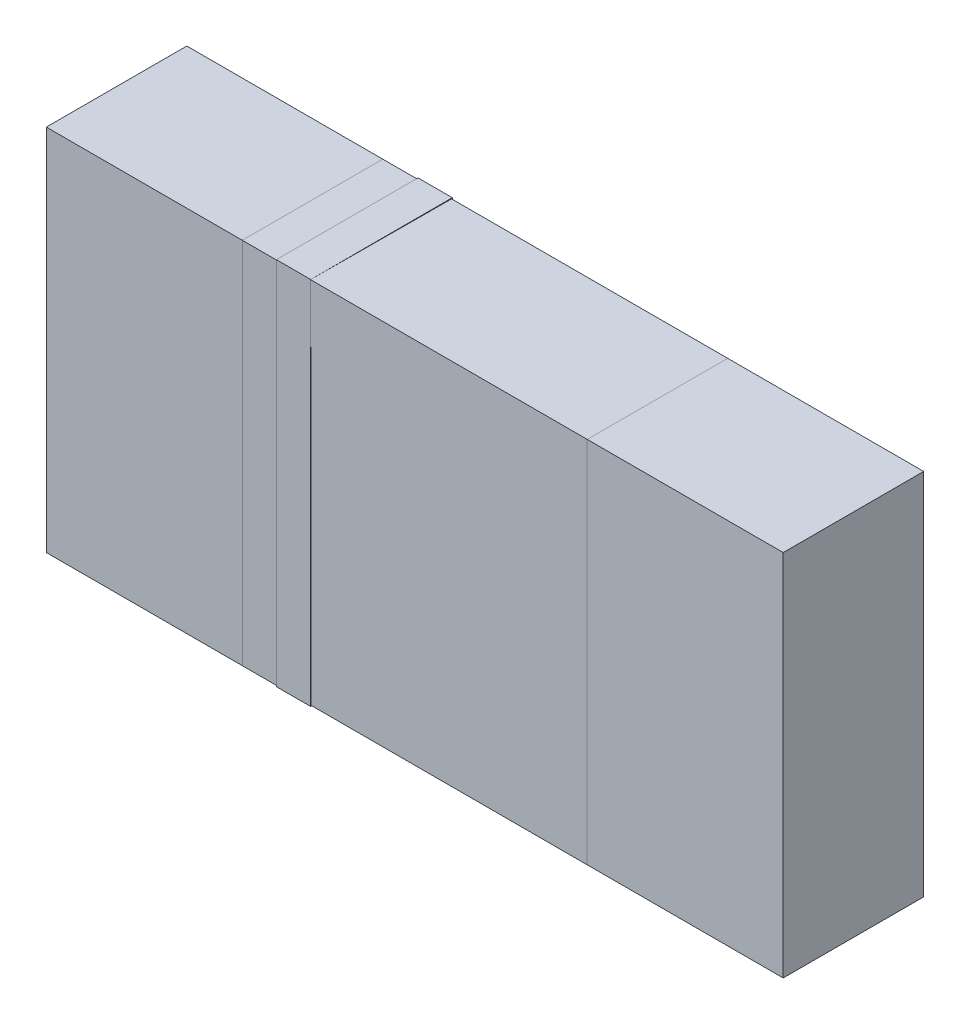
ISO-10303-21;
HEADER;
FILE_DESCRIPTION(('STEP AP214'),'2;1');
FILE_NAME('part.step','',(''),(''),'','','');
FILE_SCHEMA(('AUTOMOTIVE_DESIGN { 1 0 10303 214 1 1 1 1 }'));
ENDSEC;
DATA;
#1=APPLICATION_CONTEXT('core data for automotive mechanical design processes');
#2=APPLICATION_PROTOCOL_DEFINITION('international standard','automotive_design',2000,#1);
#3=PRODUCT_CONTEXT('',#1,'mechanical');
#4=PRODUCT('Part','Part','',(#3));
#5=PRODUCT_RELATED_PRODUCT_CATEGORY('part','',(#4));
#6=PRODUCT_DEFINITION_FORMATION('','',#4);
#7=PRODUCT_DEFINITION_CONTEXT('part definition',#1,'design');
#8=PRODUCT_DEFINITION('design','',#6,#7);
#9=PRODUCT_DEFINITION_SHAPE('','',#8);
#10=(LENGTH_UNIT() NAMED_UNIT(*) SI_UNIT(.MILLI.,.METRE.));
#11=(NAMED_UNIT(*) PLANE_ANGLE_UNIT() SI_UNIT($,.RADIAN.));
#12=(NAMED_UNIT(*) SI_UNIT($,.STERADIAN.) SOLID_ANGLE_UNIT());
#13=UNCERTAINTY_MEASURE_WITH_UNIT(LENGTH_MEASURE(1.E-05),#10,'distance_accuracy_value','');
#14=(GEOMETRIC_REPRESENTATION_CONTEXT(3) GLOBAL_UNCERTAINTY_ASSIGNED_CONTEXT((#13)) GLOBAL_UNIT_ASSIGNED_CONTEXT((#10,
#11,#12)) REPRESENTATION_CONTEXT('',''));
#15=CARTESIAN_POINT('',(0.,0.,0.));
#16=DIRECTION('',(0.,0.,1.));
#17=DIRECTION('',(1.,0.,0.));
#18=AXIS2_PLACEMENT_3D('',#15,#16,#17);
#19=CARTESIAN_POINT('',(0.749,-0.8,0.61));
#20=DIRECTION('',(0.,0.,1.));
#21=DIRECTION('',(1.,0.,0.));
#22=AXIS2_PLACEMENT_3D('',#19,#20,#21);
#23=PLANE('',#22);
#24=DIRECTION('',(1.,0.,0.));
#25=VECTOR('',#24,1.);
#26=CARTESIAN_POINT('',(0.749,-0.8,0.61));
#27=LINE('',#26,#25);
#28=CARTESIAN_POINT('',(0.749,-0.8,0.61));
#29=VERTEX_POINT('',#28);
#30=CARTESIAN_POINT('',(1.6,-0.8,0.61));
#31=VERTEX_POINT('',#30);
#32=EDGE_CURVE('P0_E83',#29,#31,#27,.T.);
#33=ORIENTED_EDGE('',*,*,#32,.T.);
#34=DIRECTION('',(0.,1.,0.));
#35=VECTOR('',#34,1.);
#36=CARTESIAN_POINT('',(1.6,-0.8,0.61));
#37=LINE('',#36,#35);
#38=CARTESIAN_POINT('',(1.6,0.8,0.61));
#39=VERTEX_POINT('',#38);
#40=EDGE_CURVE('P0_E70',#31,#39,#37,.T.);
#41=ORIENTED_EDGE('',*,*,#40,.T.);
#42=DIRECTION('',(-1.,0.,0.));
#43=VECTOR('',#42,1.);
#44=CARTESIAN_POINT('',(1.6,0.8,0.61));
#45=LINE('',#44,#43);
#46=CARTESIAN_POINT('',(0.749,0.8,0.61));
#47=VERTEX_POINT('',#46);
#48=EDGE_CURVE('P0_E98',#39,#47,#45,.T.);
#49=ORIENTED_EDGE('',*,*,#48,.T.);
#50=DIRECTION('',(0.,-1.,0.));
#51=VECTOR('',#50,1.);
#52=CARTESIAN_POINT('',(0.749,0.8,0.61));
#53=LINE('',#52,#51);
#54=EDGE_CURVE('P0_E11',#47,#29,#53,.T.);
#55=ORIENTED_EDGE('',*,*,#54,.T.);
#56=EDGE_LOOP('',(#33,#41,#49,#55));
#57=FACE_BOUND('',#56,.T.);
#58=ADVANCED_FACE('P0_F17',(#57),#23,.T.);
#59=CARTESIAN_POINT('',(0.749,0.8,0.));
#60=DIRECTION('',(0.,0.,-1.));
#61=DIRECTION('',(0.,-1.,0.));
#62=AXIS2_PLACEMENT_3D('',#59,#60,#61);
#63=PLANE('',#62);
#64=DIRECTION('',(1.,0.,0.));
#65=VECTOR('',#64,1.);
#66=CARTESIAN_POINT('',(0.749,0.8,0.));
#67=LINE('',#66,#65);
#68=CARTESIAN_POINT('',(0.749,0.8,0.));
#69=VERTEX_POINT('',#68);
#70=CARTESIAN_POINT('',(1.6,0.8,0.));
#71=VERTEX_POINT('',#70);
#72=EDGE_CURVE('P0_E81',#69,#71,#67,.T.);
#73=ORIENTED_EDGE('',*,*,#72,.T.);
#74=DIRECTION('',(0.,-1.,0.));
#75=VECTOR('',#74,1.);
#76=CARTESIAN_POINT('',(1.6,0.8,0.));
#77=LINE('',#76,#75);
#78=CARTESIAN_POINT('',(1.6,-0.8,0.));
#79=VERTEX_POINT('',#78);
#80=EDGE_CURVE('P0_E107',#71,#79,#77,.T.);
#81=ORIENTED_EDGE('',*,*,#80,.T.);
#82=DIRECTION('',(-1.,0.,0.));
#83=VECTOR('',#82,1.);
#84=CARTESIAN_POINT('',(1.6,-0.8,0.));
#85=LINE('',#84,#83);
#86=CARTESIAN_POINT('',(0.749,-0.8,0.));
#87=VERTEX_POINT('',#86);
#88=EDGE_CURVE('P0_E90',#79,#87,#85,.T.);
#89=ORIENTED_EDGE('',*,*,#88,.T.);
#90=DIRECTION('',(0.,1.,0.));
#91=VECTOR('',#90,1.);
#92=CARTESIAN_POINT('',(0.749,-0.8,0.));
#93=LINE('',#92,#91);
#94=EDGE_CURVE('P0_E25',#87,#69,#93,.T.);
#95=ORIENTED_EDGE('',*,*,#94,.T.);
#96=EDGE_LOOP('',(#73,#81,#89,#95));
#97=FACE_BOUND('',#96,.T.);
#98=ADVANCED_FACE('P0_F118',(#97),#63,.T.);
#99=CARTESIAN_POINT('',(0.749,0.8,0.));
#100=DIRECTION('',(-1.,0.,0.));
#101=DIRECTION('',(0.,0.,1.));
#102=AXIS2_PLACEMENT_3D('',#99,#100,#101);
#103=PLANE('',#102);
#104=ORIENTED_EDGE('',*,*,#94,.F.);
#105=DIRECTION('',(0.,0.,1.));
#106=VECTOR('',#105,1.);
#107=CARTESIAN_POINT('',(0.749,-0.8,0.));
#108=LINE('',#107,#106);
#109=EDGE_CURVE('P0_E87',#87,#29,#108,.T.);
#110=ORIENTED_EDGE('',*,*,#109,.T.);
#111=ORIENTED_EDGE('',*,*,#54,.F.);
#112=DIRECTION('',(0.,0.,-1.));
#113=VECTOR('',#112,1.);
#114=CARTESIAN_POINT('',(0.749,0.8,0.61));
#115=LINE('',#114,#113);
#116=EDGE_CURVE('P0_E99',#47,#69,#115,.T.);
#117=ORIENTED_EDGE('',*,*,#116,.T.);
#118=EDGE_LOOP('',(#104,#110,#111,#117));
#119=FACE_BOUND('',#118,.T.);
#120=ADVANCED_FACE('P0_F120',(#119),#103,.T.);
#121=CARTESIAN_POINT('',(1.6,0.8,0.));
#122=DIRECTION('',(0.,1.,0.));
#123=DIRECTION('',(1.,0.,0.));
#124=AXIS2_PLACEMENT_3D('',#121,#122,#123);
#125=PLANE('',#124);
#126=ORIENTED_EDGE('',*,*,#72,.F.);
#127=ORIENTED_EDGE('',*,*,#116,.F.);
#128=ORIENTED_EDGE('',*,*,#48,.F.);
#129=DIRECTION('',(0.,0.,-1.));
#130=VECTOR('',#129,1.);
#131=CARTESIAN_POINT('',(1.6,0.8,0.61));
#132=LINE('',#131,#130);
#133=EDGE_CURVE('P0_E78',#39,#71,#132,.T.);
#134=ORIENTED_EDGE('',*,*,#133,.T.);
#135=EDGE_LOOP('',(#126,#127,#128,#134));
#136=FACE_BOUND('',#135,.T.);
#137=ADVANCED_FACE('P0_F116',(#136),#125,.T.);
#138=CARTESIAN_POINT('',(1.6,-0.8,0.));
#139=DIRECTION('',(1.,0.,0.));
#140=DIRECTION('',(0.,1.,0.));
#141=AXIS2_PLACEMENT_3D('',#138,#139,#140);
#142=PLANE('',#141);
#143=ORIENTED_EDGE('',*,*,#80,.F.);
#144=ORIENTED_EDGE('',*,*,#133,.F.);
#145=ORIENTED_EDGE('',*,*,#40,.F.);
#146=DIRECTION('',(0.,0.,-1.));
#147=VECTOR('',#146,1.);
#148=CARTESIAN_POINT('',(1.6,-0.8,0.61));
#149=LINE('',#148,#147);
#150=EDGE_CURVE('P0_E75',#31,#79,#149,.T.);
#151=ORIENTED_EDGE('',*,*,#150,.T.);
#152=EDGE_LOOP('',(#143,#144,#145,#151));
#153=FACE_BOUND('',#152,.T.);
#154=ADVANCED_FACE('P0_F73',(#153),#142,.T.);
#155=CARTESIAN_POINT('',(0.749,-0.8,0.));
#156=DIRECTION('',(0.,-1.,0.));
#157=DIRECTION('',(0.,0.,-1.));
#158=AXIS2_PLACEMENT_3D('',#155,#156,#157);
#159=PLANE('',#158);
#160=ORIENTED_EDGE('',*,*,#88,.F.);
#161=ORIENTED_EDGE('',*,*,#150,.F.);
#162=ORIENTED_EDGE('',*,*,#32,.F.);
#163=ORIENTED_EDGE('',*,*,#109,.F.);
#164=EDGE_LOOP('',(#160,#161,#162,#163));
#165=FACE_BOUND('',#164,.T.);
#166=ADVANCED_FACE('P0_F89',(#165),#159,.T.);
#167=CLOSED_SHELL('',(#58,#98,#120,#137,#154,#166));
#168=MANIFOLD_SOLID_BREP('P0_B1',#167);
#169=CARTESIAN_POINT('',(-1.6,-0.8,0.61));
#170=DIRECTION('',(0.,0.,1.));
#171=DIRECTION('',(1.,0.,0.));
#172=AXIS2_PLACEMENT_3D('',#169,#170,#171);
#173=PLANE('',#172);
#174=DIRECTION('',(1.,0.,0.));
#175=VECTOR('',#174,1.);
#176=CARTESIAN_POINT('',(-1.6,-0.8,0.61));
#177=LINE('',#176,#175);
#178=CARTESIAN_POINT('',(-1.6,-0.8,0.61));
#179=VERTEX_POINT('',#178);
#180=CARTESIAN_POINT('',(-0.749,-0.8,0.61));
#181=VERTEX_POINT('',#180);
#182=EDGE_CURVE('P1_E88',#179,#181,#177,.T.);
#183=ORIENTED_EDGE('',*,*,#182,.T.);
#184=DIRECTION('',(0.,1.,0.));
#185=VECTOR('',#184,1.);
#186=CARTESIAN_POINT('',(-0.749,-0.8,0.61));
#187=LINE('',#186,#185);
#188=CARTESIAN_POINT('',(-0.749,0.8,0.61));
#189=VERTEX_POINT('',#188);
#190=EDGE_CURVE('P1_E83',#181,#189,#187,.T.);
#191=ORIENTED_EDGE('',*,*,#190,.T.);
#192=DIRECTION('',(-1.,0.,0.));
#193=VECTOR('',#192,1.);
#194=CARTESIAN_POINT('',(-0.749,0.8,0.61));
#195=LINE('',#194,#193);
#196=CARTESIAN_POINT('',(-1.6,0.8,0.61));
#197=VERTEX_POINT('',#196);
#198=EDGE_CURVE('P1_E99',#189,#197,#195,.T.);
#199=ORIENTED_EDGE('',*,*,#198,.T.);
#200=DIRECTION('',(0.,-1.,0.));
#201=VECTOR('',#200,1.);
#202=CARTESIAN_POINT('',(-1.6,0.8,0.61));
#203=LINE('',#202,#201);
#204=EDGE_CURVE('P1_E11',#197,#179,#203,.T.);
#205=ORIENTED_EDGE('',*,*,#204,.T.);
#206=EDGE_LOOP('',(#183,#191,#199,#205));
#207=FACE_BOUND('',#206,.T.);
#208=ADVANCED_FACE('P1_F17',(#207),#173,.T.);
#209=CARTESIAN_POINT('',(-1.6,0.8,0.));
#210=DIRECTION('',(0.,0.,-1.));
#211=DIRECTION('',(0.,-1.,0.));
#212=AXIS2_PLACEMENT_3D('',#209,#210,#211);
#213=PLANE('',#212);
#214=DIRECTION('',(1.,0.,0.));
#215=VECTOR('',#214,1.);
#216=CARTESIAN_POINT('',(-1.6,0.8,0.));
#217=LINE('',#216,#215);
#218=CARTESIAN_POINT('',(-1.6,0.8,0.));
#219=VERTEX_POINT('',#218);
#220=CARTESIAN_POINT('',(-0.749,0.8,0.));
#221=VERTEX_POINT('',#220);
#222=EDGE_CURVE('P1_E71',#219,#221,#217,.T.);
#223=ORIENTED_EDGE('',*,*,#222,.T.);
#224=DIRECTION('',(0.,-1.,0.));
#225=VECTOR('',#224,1.);
#226=CARTESIAN_POINT('',(-0.749,0.8,0.));
#227=LINE('',#226,#225);
#228=CARTESIAN_POINT('',(-0.749,-0.8,0.));
#229=VERTEX_POINT('',#228);
#230=EDGE_CURVE('P1_E65',#221,#229,#227,.T.);
#231=ORIENTED_EDGE('',*,*,#230,.T.);
#232=DIRECTION('',(-1.,0.,0.));
#233=VECTOR('',#232,1.);
#234=CARTESIAN_POINT('',(-0.749,-0.8,0.));
#235=LINE('',#234,#233);
#236=CARTESIAN_POINT('',(-1.6,-0.8,0.));
#237=VERTEX_POINT('',#236);
#238=EDGE_CURVE('P1_E69',#229,#237,#235,.T.);
#239=ORIENTED_EDGE('',*,*,#238,.T.);
#240=DIRECTION('',(0.,1.,0.));
#241=VECTOR('',#240,1.);
#242=CARTESIAN_POINT('',(-1.6,-0.8,0.));
#243=LINE('',#242,#241);
#244=EDGE_CURVE('P1_E26',#237,#219,#243,.T.);
#245=ORIENTED_EDGE('',*,*,#244,.T.);
#246=EDGE_LOOP('',(#223,#231,#239,#245));
#247=FACE_BOUND('',#246,.T.);
#248=ADVANCED_FACE('P1_F67',(#247),#213,.T.);
#249=CARTESIAN_POINT('',(-1.6,0.8,0.));
#250=DIRECTION('',(-1.,0.,0.));
#251=DIRECTION('',(0.,0.,1.));
#252=AXIS2_PLACEMENT_3D('',#249,#250,#251);
#253=PLANE('',#252);
#254=ORIENTED_EDGE('',*,*,#244,.F.);
#255=DIRECTION('',(0.,0.,1.));
#256=VECTOR('',#255,1.);
#257=CARTESIAN_POINT('',(-1.6,-0.8,0.));
#258=LINE('',#257,#256);
#259=EDGE_CURVE('P1_E77',#237,#179,#258,.T.);
#260=ORIENTED_EDGE('',*,*,#259,.T.);
#261=ORIENTED_EDGE('',*,*,#204,.F.);
#262=DIRECTION('',(0.,0.,-1.));
#263=VECTOR('',#262,1.);
#264=CARTESIAN_POINT('',(-1.6,0.8,0.61));
#265=LINE('',#264,#263);
#266=EDGE_CURVE('P1_E109',#197,#219,#265,.T.);
#267=ORIENTED_EDGE('',*,*,#266,.T.);
#268=EDGE_LOOP('',(#254,#260,#261,#267));
#269=FACE_BOUND('',#268,.T.);
#270=ADVANCED_FACE('P1_F117',(#269),#253,.T.);
#271=CARTESIAN_POINT('',(-0.749,0.8,0.));
#272=DIRECTION('',(0.,1.,0.));
#273=DIRECTION('',(1.,0.,0.));
#274=AXIS2_PLACEMENT_3D('',#271,#272,#273);
#275=PLANE('',#274);
#276=ORIENTED_EDGE('',*,*,#222,.F.);
#277=ORIENTED_EDGE('',*,*,#266,.F.);
#278=ORIENTED_EDGE('',*,*,#198,.F.);
#279=DIRECTION('',(0.,0.,-1.));
#280=VECTOR('',#279,1.);
#281=CARTESIAN_POINT('',(-0.749,0.8,0.61));
#282=LINE('',#281,#280);
#283=EDGE_CURVE('P1_E76',#189,#221,#282,.T.);
#284=ORIENTED_EDGE('',*,*,#283,.T.);
#285=EDGE_LOOP('',(#276,#277,#278,#284));
#286=FACE_BOUND('',#285,.T.);
#287=ADVANCED_FACE('P1_F116',(#286),#275,.T.);
#288=CARTESIAN_POINT('',(-0.749,-0.8,0.));
#289=DIRECTION('',(1.,0.,0.));
#290=DIRECTION('',(0.,1.,0.));
#291=AXIS2_PLACEMENT_3D('',#288,#289,#290);
#292=PLANE('',#291);
#293=ORIENTED_EDGE('',*,*,#230,.F.);
#294=ORIENTED_EDGE('',*,*,#283,.F.);
#295=ORIENTED_EDGE('',*,*,#190,.F.);
#296=DIRECTION('',(0.,0.,-1.));
#297=VECTOR('',#296,1.);
#298=CARTESIAN_POINT('',(-0.749,-0.8,0.61));
#299=LINE('',#298,#297);
#300=EDGE_CURVE('P1_E80',#181,#229,#299,.T.);
#301=ORIENTED_EDGE('',*,*,#300,.T.);
#302=EDGE_LOOP('',(#293,#294,#295,#301));
#303=FACE_BOUND('',#302,.T.);
#304=ADVANCED_FACE('P1_F81',(#303),#292,.T.);
#305=CARTESIAN_POINT('',(-1.6,-0.8,0.));
#306=DIRECTION('',(0.,-1.,0.));
#307=DIRECTION('',(0.,0.,-1.));
#308=AXIS2_PLACEMENT_3D('',#305,#306,#307);
#309=PLANE('',#308);
#310=ORIENTED_EDGE('',*,*,#238,.F.);
#311=ORIENTED_EDGE('',*,*,#300,.F.);
#312=ORIENTED_EDGE('',*,*,#182,.F.);
#313=ORIENTED_EDGE('',*,*,#259,.F.);
#314=EDGE_LOOP('',(#310,#311,#312,#313));
#315=FACE_BOUND('',#314,.T.);
#316=ADVANCED_FACE('P1_F91',(#315),#309,.T.);
#317=CLOSED_SHELL('',(#208,#248,#270,#287,#304,#316));
#318=MANIFOLD_SOLID_BREP('P1_B1',#317);
#319=CARTESIAN_POINT('',(-0.749,-0.8,0.61));
#320=DIRECTION('',(0.,0.,1.));
#321=DIRECTION('',(1.,0.,0.));
#322=AXIS2_PLACEMENT_3D('',#319,#320,#321);
#323=PLANE('',#322);
#324=DIRECTION('',(1.,0.,0.));
#325=VECTOR('',#324,1.);
#326=CARTESIAN_POINT('',(-0.749,-0.8,0.61));
#327=LINE('',#326,#325);
#328=CARTESIAN_POINT('',(-0.749,-0.8,0.61));
#329=VERTEX_POINT('',#328);
#330=CARTESIAN_POINT('',(0.749,-0.8,0.61));
#331=VERTEX_POINT('',#330);
#332=EDGE_CURVE('P2_E78',#329,#331,#327,.T.);
#333=ORIENTED_EDGE('',*,*,#332,.T.);
#334=DIRECTION('',(0.,1.,0.));
#335=VECTOR('',#334,1.);
#336=CARTESIAN_POINT('',(0.749,-0.8,0.61));
#337=LINE('',#336,#335);
#338=CARTESIAN_POINT('',(0.749,0.8,0.61));
#339=VERTEX_POINT('',#338);
#340=EDGE_CURVE('P2_E76',#331,#339,#337,.T.);
#341=ORIENTED_EDGE('',*,*,#340,.T.);
#342=DIRECTION('',(-1.,0.,0.));
#343=VECTOR('',#342,1.);
#344=CARTESIAN_POINT('',(0.749,0.8,0.61));
#345=LINE('',#344,#343);
#346=CARTESIAN_POINT('',(-0.749,0.8,0.61));
#347=VERTEX_POINT('',#346);
#348=EDGE_CURVE('P2_E64',#339,#347,#345,.T.);
#349=ORIENTED_EDGE('',*,*,#348,.T.);
#350=DIRECTION('',(0.,-1.,0.));
#351=VECTOR('',#350,1.);
#352=CARTESIAN_POINT('',(-0.749,0.8,0.61));
#353=LINE('',#352,#351);
#354=EDGE_CURVE('P2_E11',#347,#329,#353,.T.);
#355=ORIENTED_EDGE('',*,*,#354,.T.);
#356=EDGE_LOOP('',(#333,#341,#349,#355));
#357=FACE_BOUND('',#356,.T.);
#358=ADVANCED_FACE('P2_F17',(#357),#323,.T.);
#359=CARTESIAN_POINT('',(-0.749,0.8,0.));
#360=DIRECTION('',(0.,0.,-1.));
#361=DIRECTION('',(0.,-1.,0.));
#362=AXIS2_PLACEMENT_3D('',#359,#360,#361);
#363=PLANE('',#362);
#364=DIRECTION('',(1.,0.,0.));
#365=VECTOR('',#364,1.);
#366=CARTESIAN_POINT('',(-0.749,0.8,0.));
#367=LINE('',#366,#365);
#368=CARTESIAN_POINT('',(-0.749,0.8,0.));
#369=VERTEX_POINT('',#368);
#370=CARTESIAN_POINT('',(0.749,0.8,0.));
#371=VERTEX_POINT('',#370);
#372=EDGE_CURVE('P2_E83',#369,#371,#367,.T.);
#373=ORIENTED_EDGE('',*,*,#372,.T.);
#374=DIRECTION('',(0.,-1.,0.));
#375=VECTOR('',#374,1.);
#376=CARTESIAN_POINT('',(0.749,0.8,0.));
#377=LINE('',#376,#375);
#378=CARTESIAN_POINT('',(0.749,-0.8,0.));
#379=VERTEX_POINT('',#378);
#380=EDGE_CURVE('P2_E86',#371,#379,#377,.T.);
#381=ORIENTED_EDGE('',*,*,#380,.T.);
#382=DIRECTION('',(-1.,0.,0.));
#383=VECTOR('',#382,1.);
#384=CARTESIAN_POINT('',(0.749,-0.8,0.));
#385=LINE('',#384,#383);
#386=CARTESIAN_POINT('',(-0.749,-0.8,0.));
#387=VERTEX_POINT('',#386);
#388=EDGE_CURVE('P2_E104',#379,#387,#385,.T.);
#389=ORIENTED_EDGE('',*,*,#388,.T.);
#390=DIRECTION('',(0.,1.,0.));
#391=VECTOR('',#390,1.);
#392=CARTESIAN_POINT('',(-0.749,-0.8,0.));
#393=LINE('',#392,#391);
#394=EDGE_CURVE('P2_E20',#387,#369,#393,.T.);
#395=ORIENTED_EDGE('',*,*,#394,.T.);
#396=EDGE_LOOP('',(#373,#381,#389,#395));
#397=FACE_BOUND('',#396,.T.);
#398=ADVANCED_FACE('P2_F111',(#397),#363,.T.);
#399=CARTESIAN_POINT('',(-0.749,0.8,0.));
#400=DIRECTION('',(-1.,0.,0.));
#401=DIRECTION('',(0.,0.,1.));
#402=AXIS2_PLACEMENT_3D('',#399,#400,#401);
#403=PLANE('',#402);
#404=ORIENTED_EDGE('',*,*,#394,.F.);
#405=DIRECTION('',(0.,0.,1.));
#406=VECTOR('',#405,1.);
#407=CARTESIAN_POINT('',(-0.749,-0.8,0.));
#408=LINE('',#407,#406);
#409=EDGE_CURVE('P2_E92',#387,#329,#408,.T.);
#410=ORIENTED_EDGE('',*,*,#409,.T.);
#411=ORIENTED_EDGE('',*,*,#354,.F.);
#412=DIRECTION('',(0.,0.,-1.));
#413=VECTOR('',#412,1.);
#414=CARTESIAN_POINT('',(-0.749,0.8,0.61));
#415=LINE('',#414,#413);
#416=EDGE_CURVE('P2_E71',#347,#369,#415,.T.);
#417=ORIENTED_EDGE('',*,*,#416,.T.);
#418=EDGE_LOOP('',(#404,#410,#411,#417));
#419=FACE_BOUND('',#418,.T.);
#420=ADVANCED_FACE('P2_F130',(#419),#403,.T.);
#421=CARTESIAN_POINT('',(0.749,0.8,0.));
#422=DIRECTION('',(0.,1.,0.));
#423=DIRECTION('',(1.,0.,0.));
#424=AXIS2_PLACEMENT_3D('',#421,#422,#423);
#425=PLANE('',#424);
#426=ORIENTED_EDGE('',*,*,#372,.F.);
#427=ORIENTED_EDGE('',*,*,#416,.F.);
#428=ORIENTED_EDGE('',*,*,#348,.F.);
#429=DIRECTION('',(0.,0.,-1.));
#430=VECTOR('',#429,1.);
#431=CARTESIAN_POINT('',(0.749,0.8,0.61));
#432=LINE('',#431,#430);
#433=EDGE_CURVE('P2_E69',#339,#371,#432,.T.);
#434=ORIENTED_EDGE('',*,*,#433,.T.);
#435=EDGE_LOOP('',(#426,#427,#428,#434));
#436=FACE_BOUND('',#435,.T.);
#437=ADVANCED_FACE('P2_F67',(#436),#425,.T.);
#438=CARTESIAN_POINT('',(0.749,-0.8,0.));
#439=DIRECTION('',(1.,0.,0.));
#440=DIRECTION('',(0.,1.,0.));
#441=AXIS2_PLACEMENT_3D('',#438,#439,#440);
#442=PLANE('',#441);
#443=ORIENTED_EDGE('',*,*,#380,.F.);
#444=ORIENTED_EDGE('',*,*,#433,.F.);
#445=ORIENTED_EDGE('',*,*,#340,.F.);
#446=DIRECTION('',(0.,0.,-1.));
#447=VECTOR('',#446,1.);
#448=CARTESIAN_POINT('',(0.749,-0.8,0.61));
#449=LINE('',#448,#447);
#450=EDGE_CURVE('P2_E100',#331,#379,#449,.T.);
#451=ORIENTED_EDGE('',*,*,#450,.T.);
#452=EDGE_LOOP('',(#443,#444,#445,#451));
#453=FACE_BOUND('',#452,.T.);
#454=ADVANCED_FACE('P2_F84',(#453),#442,.T.);
#455=CARTESIAN_POINT('',(-0.749,-0.8,0.));
#456=DIRECTION('',(0.,-1.,0.));
#457=DIRECTION('',(0.,0.,-1.));
#458=AXIS2_PLACEMENT_3D('',#455,#456,#457);
#459=PLANE('',#458);
#460=ORIENTED_EDGE('',*,*,#388,.F.);
#461=ORIENTED_EDGE('',*,*,#450,.F.);
#462=ORIENTED_EDGE('',*,*,#332,.F.);
#463=ORIENTED_EDGE('',*,*,#409,.F.);
#464=EDGE_LOOP('',(#460,#461,#462,#463));
#465=FACE_BOUND('',#464,.T.);
#466=ADVANCED_FACE('P2_F114',(#465),#459,.T.);
#467=CLOSED_SHELL('',(#358,#398,#420,#437,#454,#466));
#468=MANIFOLD_SOLID_BREP('P2_B1',#467);
#469=CARTESIAN_POINT('',(-0.45,-0.8,0.61));
#470=DIRECTION('',(0.,0.,-1.));
#471=DIRECTION('',(0.,-1.,0.));
#472=AXIS2_PLACEMENT_3D('',#469,#470,#471);
#473=PLANE('',#472);
#474=DIRECTION('',(-1.,0.,0.));
#475=VECTOR('',#474,1.);
#476=CARTESIAN_POINT('',(-0.45,-0.8,0.61));
#477=LINE('',#476,#475);
#478=CARTESIAN_POINT('',(-0.45,-0.8,0.61));
#479=VERTEX_POINT('',#478);
#480=CARTESIAN_POINT('',(-0.599,-0.8,0.61));
#481=VERTEX_POINT('',#480);
#482=EDGE_CURVE('P3_E11',#479,#481,#477,.T.);
#483=ORIENTED_EDGE('',*,*,#482,.T.);
#484=DIRECTION('',(0.,1.,0.));
#485=VECTOR('',#484,1.);
#486=CARTESIAN_POINT('',(-0.599,-0.8,0.61));
#487=LINE('',#486,#485);
#488=CARTESIAN_POINT('',(-0.599,0.8,0.61));
#489=VERTEX_POINT('',#488);
#490=EDGE_CURVE('P3_E133',#481,#489,#487,.T.);
#491=ORIENTED_EDGE('',*,*,#490,.T.);
#492=DIRECTION('',(1.,0.,0.));
#493=VECTOR('',#492,1.);
#494=CARTESIAN_POINT('',(-0.599,0.8,0.61));
#495=LINE('',#494,#493);
#496=CARTESIAN_POINT('',(-0.45,0.803,0.612));
#497=VERTEX_POINT('',#496);
#498=EDGE_CURVE('P3_E50',#489,#497,#495,.T.);
#499=ORIENTED_EDGE('',*,*,#498,.T.);
#500=DIRECTION('',(0.,-1.,0.));
#501=VECTOR('',#500,1.);
#502=CARTESIAN_POINT('',(-0.45,0.8,0.61));
#503=LINE('',#502,#501);
#504=EDGE_CURVE('P3_E123',#497,#479,#503,.T.);
#505=ORIENTED_EDGE('',*,*,#504,.T.);
#506=EDGE_LOOP('',(#483,#491,#499,#505));
#507=FACE_BOUND('',#506,.T.);
#508=ADVANCED_FACE('P3_F17',(#507),#473,.T.);
#509=CARTESIAN_POINT('',(-0.599,-0.8,0.));
#510=DIRECTION('',(0.,0.,1.));
#511=DIRECTION('',(1.,0.,0.));
#512=AXIS2_PLACEMENT_3D('',#509,#510,#511);
#513=PLANE('',#512);
#514=DIRECTION('',(1.,0.,0.));
#515=VECTOR('',#514,1.);
#516=CARTESIAN_POINT('',(-0.599,-0.8,0.));
#517=LINE('',#516,#515);
#518=CARTESIAN_POINT('',(-0.599,-0.8,0.));
#519=VERTEX_POINT('',#518);
#520=CARTESIAN_POINT('',(-0.45,-0.8,0.));
#521=VERTEX_POINT('',#520);
#522=EDGE_CURVE('P3_E26',#519,#521,#517,.T.);
#523=ORIENTED_EDGE('',*,*,#522,.T.);
#524=DIRECTION('',(0.,1.,0.));
#525=VECTOR('',#524,1.);
#526=CARTESIAN_POINT('',(-0.45,-0.8,0.));
#527=LINE('',#526,#525);
#528=CARTESIAN_POINT('',(-0.45,0.8,0.));
#529=VERTEX_POINT('',#528);
#530=EDGE_CURVE('P3_E118',#521,#529,#527,.T.);
#531=ORIENTED_EDGE('',*,*,#530,.T.);
#532=DIRECTION('',(-1.,0.,0.));
#533=VECTOR('',#532,1.);
#534=CARTESIAN_POINT('',(-0.45,0.8,0.));
#535=LINE('',#534,#533);
#536=CARTESIAN_POINT('',(-0.599,0.8,0.));
#537=VERTEX_POINT('',#536);
#538=EDGE_CURVE('P3_E112',#529,#537,#535,.T.);
#539=ORIENTED_EDGE('',*,*,#538,.T.);
#540=DIRECTION('',(0.,-1.,0.));
#541=VECTOR('',#540,1.);
#542=CARTESIAN_POINT('',(-0.599,0.8,0.));
#543=LINE('',#542,#541);
#544=EDGE_CURVE('P3_E205',#537,#519,#543,.T.);
#545=ORIENTED_EDGE('',*,*,#544,.T.);
#546=EDGE_LOOP('',(#523,#531,#539,#545));
#547=FACE_BOUND('',#546,.T.);
#548=ADVANCED_FACE('P3_F202',(#547),#513,.T.);
#549=CARTESIAN_POINT('',(-0.45,-0.8,0.));
#550=DIRECTION('',(0.,1.,0.));
#551=DIRECTION('',(1.,0.,0.));
#552=AXIS2_PLACEMENT_3D('',#549,#550,#551);
#553=PLANE('',#552);
#554=ORIENTED_EDGE('',*,*,#522,.F.);
#555=DIRECTION('',(0.,0.,1.));
#556=VECTOR('',#555,1.);
#557=CARTESIAN_POINT('',(-0.599,-0.8,0.));
#558=LINE('',#557,#556);
#559=EDGE_CURVE('P3_E374',#519,#481,#558,.T.);
#560=ORIENTED_EDGE('',*,*,#559,.T.);
#561=ORIENTED_EDGE('',*,*,#482,.F.);
#562=DIRECTION('',(0.,0.,-1.));
#563=VECTOR('',#562,1.);
#564=CARTESIAN_POINT('',(-0.45,-0.8,0.61));
#565=LINE('',#564,#563);
#566=EDGE_CURVE('P3_E129',#479,#521,#565,.T.);
#567=ORIENTED_EDGE('',*,*,#566,.T.);
#568=EDGE_LOOP('',(#554,#560,#561,#567));
#569=FACE_BOUND('',#568,.T.);
#570=ADVANCED_FACE('P3_F207',(#569),#553,.T.);
#571=CARTESIAN_POINT('',(-0.599,0.8,0.));
#572=DIRECTION('',(0.,-1.,0.));
#573=DIRECTION('',(0.,0.,-1.));
#574=AXIS2_PLACEMENT_3D('',#571,#572,#573);
#575=PLANE('',#574);
#576=ORIENTED_EDGE('',*,*,#538,.F.);
#577=DIRECTION('',(0.,0.,1.));
#578=VECTOR('',#577,1.);
#579=CARTESIAN_POINT('',(-0.45,0.8,0.));
#580=LINE('',#579,#578);
#581=EDGE_CURVE('P3_E109',#529,#497,#580,.T.);
#582=ORIENTED_EDGE('',*,*,#581,.T.);
#583=ORIENTED_EDGE('',*,*,#498,.F.);
#584=DIRECTION('',(0.,0.,-1.));
#585=VECTOR('',#584,1.);
#586=CARTESIAN_POINT('',(-0.599,0.8,0.61));
#587=LINE('',#586,#585);
#588=EDGE_CURVE('P3_E383',#489,#537,#587,.T.);
#589=ORIENTED_EDGE('',*,*,#588,.T.);
#590=EDGE_LOOP('',(#576,#582,#583,#589));
#591=FACE_BOUND('',#590,.T.);
#592=ADVANCED_FACE('P3_F111',(#591),#575,.T.);
#593=CARTESIAN_POINT('',(-0.599,-0.8,0.));
#594=DIRECTION('',(-1.,0.,0.));
#595=DIRECTION('',(0.,0.,1.));
#596=AXIS2_PLACEMENT_3D('',#593,#594,#595);
#597=PLANE('',#596);
#598=DIRECTION('',(0.,-0.707106781186548,-0.707106781186548));
#599=VECTOR('',#598,1.);
#600=CARTESIAN_POINT('',(-0.599,-0.8,0.));
#601=LINE('',#600,#599);
#602=CARTESIAN_POINT('',(-0.599,-0.803,-0.003));
#603=VERTEX_POINT('',#602);
#604=EDGE_CURVE('P3_E131',#519,#603,#601,.T.);
#605=ORIENTED_EDGE('',*,*,#604,.T.);
#606=DIRECTION('',(0.,0.,1.));
#607=VECTOR('',#606,1.);
#608=CARTESIAN_POINT('',(-0.599,-0.803,-0.003));
#609=LINE('',#608,#607);
#610=CARTESIAN_POINT('',(-0.599,-0.803,0.612));
#611=VERTEX_POINT('',#610);
#612=EDGE_CURVE('P3_E162',#603,#611,#609,.T.);
#613=ORIENTED_EDGE('',*,*,#612,.T.);
#614=DIRECTION('',(0.,1.,0.));
#615=VECTOR('',#614,1.);
#616=CARTESIAN_POINT('',(-0.599,-0.803,0.612));
#617=LINE('',#616,#615);
#618=CARTESIAN_POINT('',(-0.599,0.803,0.612));
#619=VERTEX_POINT('',#618);
#620=EDGE_CURVE('P3_E119',#611,#619,#617,.T.);
#621=ORIENTED_EDGE('',*,*,#620,.T.);
#622=DIRECTION('',(0.,-0.707106781186548,-0.707106781186548));
#623=VECTOR('',#622,1.);
#624=CARTESIAN_POINT('',(-0.599,0.803,0.612));
#625=LINE('',#624,#623);
#626=EDGE_CURVE('P3_E104',#619,#489,#625,.T.);
#627=ORIENTED_EDGE('',*,*,#626,.T.);
#628=ORIENTED_EDGE('',*,*,#490,.F.);
#629=ORIENTED_EDGE('',*,*,#559,.F.);
#630=EDGE_LOOP('',(#605,#613,#621,#627,#628,#629));
#631=FACE_BOUND('',#630,.T.);
#632=ADVANCED_FACE('P3_F215',(#631),#597,.T.);
#633=CARTESIAN_POINT('',(-0.599,0.803,-0.003));
#634=DIRECTION('',(-1.,0.,0.));
#635=DIRECTION('',(0.,0.,1.));
#636=AXIS2_PLACEMENT_3D('',#633,#634,#635);
#637=PLANE('',#636);
#638=DIRECTION('',(0.,-1.,0.));
#639=VECTOR('',#638,1.);
#640=CARTESIAN_POINT('',(-0.599,0.803,-0.003));
#641=LINE('',#640,#639);
#642=CARTESIAN_POINT('',(-0.599,0.803,-0.003));
#643=VERTEX_POINT('',#642);
#644=EDGE_CURVE('P3_E178',#643,#603,#641,.T.);
#645=ORIENTED_EDGE('',*,*,#644,.T.);
#646=ORIENTED_EDGE('',*,*,#604,.F.);
#647=ORIENTED_EDGE('',*,*,#544,.F.);
#648=ORIENTED_EDGE('',*,*,#588,.F.);
#649=ORIENTED_EDGE('',*,*,#626,.F.);
#650=DIRECTION('',(0.,0.,-1.));
#651=VECTOR('',#650,1.);
#652=CARTESIAN_POINT('',(-0.599,0.803,0.612));
#653=LINE('',#652,#651);
#654=EDGE_CURVE('P3_E157',#619,#643,#653,.T.);
#655=ORIENTED_EDGE('',*,*,#654,.T.);
#656=EDGE_LOOP('',(#645,#646,#647,#648,#649,#655));
#657=FACE_BOUND('',#656,.T.);
#658=ADVANCED_FACE('P3_F258',(#657),#637,.T.);
#659=CARTESIAN_POINT('',(-0.45,-0.803,-0.003));
#660=DIRECTION('',(1.,0.,0.));
#661=DIRECTION('',(0.,1.,0.));
#662=AXIS2_PLACEMENT_3D('',#659,#660,#661);
#663=PLANE('',#662);
#664=DIRECTION('',(0.,0.,-1.));
#665=VECTOR('',#664,1.);
#666=CARTESIAN_POINT('',(-0.45,-0.803,0.612));
#667=LINE('',#666,#665);
#668=CARTESIAN_POINT('',(-0.45,-0.803,0.612));
#669=VERTEX_POINT('',#668);
#670=EDGE_CURVE('P3_E181',#669,#521,#667,.T.);
#671=ORIENTED_EDGE('',*,*,#670,.T.);
#672=ORIENTED_EDGE('',*,*,#566,.F.);
#673=ORIENTED_EDGE('',*,*,#504,.F.);
#674=DIRECTION('',(0.,-1.,0.));
#675=VECTOR('',#674,1.);
#676=CARTESIAN_POINT('',(-0.45,0.803,0.612));
#677=LINE('',#676,#675);
#678=EDGE_CURVE('P3_E127',#497,#669,#677,.T.);
#679=ORIENTED_EDGE('',*,*,#678,.T.);
#680=EDGE_LOOP('',(#671,#672,#673,#679));
#681=FACE_BOUND('',#680,.T.);
#682=ADVANCED_FACE('P3_F125',(#681),#663,.T.);
#683=CARTESIAN_POINT('',(-0.45,-0.803,-0.003));
#684=DIRECTION('',(1.,0.,0.));
#685=DIRECTION('',(0.,1.,0.));
#686=AXIS2_PLACEMENT_3D('',#683,#684,#685);
#687=PLANE('',#686);
#688=DIRECTION('',(0.,1.,0.));
#689=VECTOR('',#688,1.);
#690=CARTESIAN_POINT('',(-0.45,-0.803,-0.003));
#691=LINE('',#690,#689);
#692=CARTESIAN_POINT('',(-0.45,0.803,-0.003));
#693=VERTEX_POINT('',#692);
#694=EDGE_CURVE('P3_E150',#521,#693,#691,.T.);
#695=ORIENTED_EDGE('',*,*,#694,.T.);
#696=DIRECTION('',(0.,0.,1.));
#697=VECTOR('',#696,1.);
#698=CARTESIAN_POINT('',(-0.45,0.803,-0.003));
#699=LINE('',#698,#697);
#700=EDGE_CURVE('P3_E146',#693,#497,#699,.T.);
#701=ORIENTED_EDGE('',*,*,#700,.T.);
#702=ORIENTED_EDGE('',*,*,#581,.F.);
#703=ORIENTED_EDGE('',*,*,#530,.F.);
#704=EDGE_LOOP('',(#695,#701,#702,#703));
#705=FACE_BOUND('',#704,.T.);
#706=ADVANCED_FACE('P3_F149',(#705),#687,.T.);
#707=CARTESIAN_POINT('',(-0.599,-0.803,0.612));
#708=DIRECTION('',(0.,0.,1.));
#709=DIRECTION('',(1.,0.,0.));
#710=AXIS2_PLACEMENT_3D('',#707,#708,#709);
#711=PLANE('',#710);
#712=DIRECTION('',(1.,0.,0.));
#713=VECTOR('',#712,1.);
#714=CARTESIAN_POINT('',(-0.599,-0.803,0.612));
#715=LINE('',#714,#713);
#716=EDGE_CURVE('P3_E143',#611,#669,#715,.T.);
#717=ORIENTED_EDGE('',*,*,#716,.T.);
#718=ORIENTED_EDGE('',*,*,#678,.F.);
#719=DIRECTION('',(-1.,0.,0.));
#720=VECTOR('',#719,1.);
#721=CARTESIAN_POINT('',(-0.45,0.803,0.612));
#722=LINE('',#721,#720);
#723=EDGE_CURVE('P3_E140',#497,#619,#722,.T.);
#724=ORIENTED_EDGE('',*,*,#723,.T.);
#725=ORIENTED_EDGE('',*,*,#620,.F.);
#726=EDGE_LOOP('',(#717,#718,#724,#725));
#727=FACE_BOUND('',#726,.T.);
#728=ADVANCED_FACE('P3_F138',(#727),#711,.T.);
#729=CARTESIAN_POINT('',(-0.45,0.803,-0.003));
#730=DIRECTION('',(0.,1.,0.));
#731=DIRECTION('',(1.,0.,0.));
#732=AXIS2_PLACEMENT_3D('',#729,#730,#731);
#733=PLANE('',#732);
#734=DIRECTION('',(-1.,0.,0.));
#735=VECTOR('',#734,1.);
#736=CARTESIAN_POINT('',(-0.45,0.803,-0.003));
#737=LINE('',#736,#735);
#738=EDGE_CURVE('P3_E172',#693,#643,#737,.T.);
#739=ORIENTED_EDGE('',*,*,#738,.T.);
#740=ORIENTED_EDGE('',*,*,#654,.F.);
#741=ORIENTED_EDGE('',*,*,#723,.F.);
#742=ORIENTED_EDGE('',*,*,#700,.F.);
#743=EDGE_LOOP('',(#739,#740,#741,#742));
#744=FACE_BOUND('',#743,.T.);
#745=ADVANCED_FACE('P3_F156',(#744),#733,.T.);
#746=CARTESIAN_POINT('',(-0.599,-0.803,-0.003));
#747=DIRECTION('',(0.,-1.,0.));
#748=DIRECTION('',(0.,0.,-1.));
#749=AXIS2_PLACEMENT_3D('',#746,#747,#748);
#750=PLANE('',#749);
#751=DIRECTION('',(1.,0.,0.));
#752=VECTOR('',#751,1.);
#753=CARTESIAN_POINT('',(-0.599,-0.803,-0.003));
#754=LINE('',#753,#752);
#755=EDGE_CURVE('P3_E171',#603,#521,#754,.T.);
#756=ORIENTED_EDGE('',*,*,#755,.T.);
#757=ORIENTED_EDGE('',*,*,#670,.F.);
#758=ORIENTED_EDGE('',*,*,#716,.F.);
#759=ORIENTED_EDGE('',*,*,#612,.F.);
#760=EDGE_LOOP('',(#756,#757,#758,#759));
#761=FACE_BOUND('',#760,.T.);
#762=ADVANCED_FACE('P3_F305',(#761),#750,.T.);
#763=CARTESIAN_POINT('',(-0.599,0.803,-0.003));
#764=DIRECTION('',(0.,0.,-1.));
#765=DIRECTION('',(0.,-1.,0.));
#766=AXIS2_PLACEMENT_3D('',#763,#764,#765);
#767=PLANE('',#766);
#768=ORIENTED_EDGE('',*,*,#738,.F.);
#769=ORIENTED_EDGE('',*,*,#694,.F.);
#770=ORIENTED_EDGE('',*,*,#755,.F.);
#771=ORIENTED_EDGE('',*,*,#644,.F.);
#772=EDGE_LOOP('',(#768,#769,#770,#771));
#773=FACE_BOUND('',#772,.T.);
#774=ADVANCED_FACE('P3_F314',(#773),#767,.T.);
#775=CLOSED_SHELL('',(#508,#548,#570,#592,#632,#658,#682,#706,#728,#745,#762,#774));
#776=MANIFOLD_SOLID_BREP('P3_B1',#775);
#777=ADVANCED_BREP_SHAPE_REPRESENTATION('',(#18,#168,#318,#468,#776),#14);
#778=SHAPE_DEFINITION_REPRESENTATION(#9,#777);
ENDSEC;
END-ISO-10303-21;
